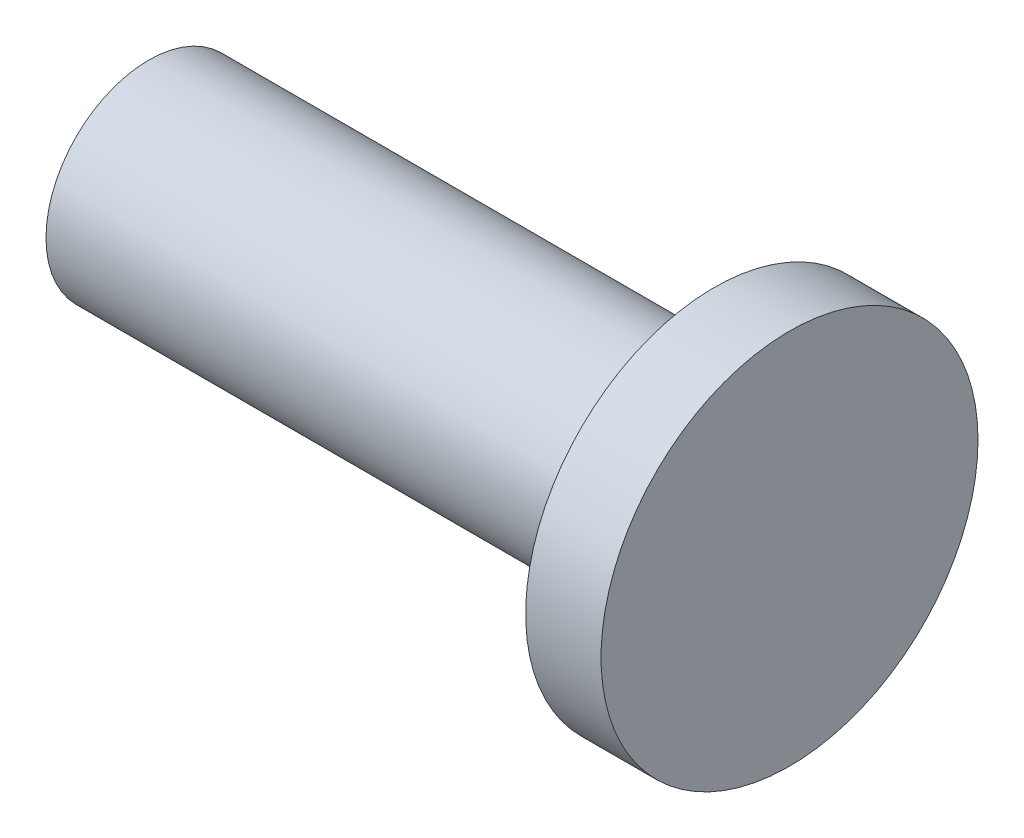
ISO-10303-21;
HEADER;
FILE_DESCRIPTION(('STEP AP214'),'2;1');
FILE_NAME('part.step','',(''),(''),'','','');
FILE_SCHEMA(('AUTOMOTIVE_DESIGN { 1 0 10303 214 1 1 1 1 }'));
ENDSEC;
DATA;
#1=APPLICATION_CONTEXT('core data for automotive mechanical design processes');
#2=APPLICATION_PROTOCOL_DEFINITION('international standard','automotive_design',2000,#1);
#3=PRODUCT_CONTEXT('',#1,'mechanical');
#4=PRODUCT('Part','Part','',(#3));
#5=PRODUCT_RELATED_PRODUCT_CATEGORY('part','',(#4));
#6=PRODUCT_DEFINITION_FORMATION('','',#4);
#7=PRODUCT_DEFINITION_CONTEXT('part definition',#1,'design');
#8=PRODUCT_DEFINITION('design','',#6,#7);
#9=PRODUCT_DEFINITION_SHAPE('','',#8);
#10=(LENGTH_UNIT() NAMED_UNIT(*) SI_UNIT(.MILLI.,.METRE.));
#11=(NAMED_UNIT(*) PLANE_ANGLE_UNIT() SI_UNIT($,.RADIAN.));
#12=(NAMED_UNIT(*) SI_UNIT($,.STERADIAN.) SOLID_ANGLE_UNIT());
#13=UNCERTAINTY_MEASURE_WITH_UNIT(LENGTH_MEASURE(1.E-05),#10,'distance_accuracy_value','');
#14=(GEOMETRIC_REPRESENTATION_CONTEXT(3) GLOBAL_UNCERTAINTY_ASSIGNED_CONTEXT((#13)) GLOBAL_UNIT_ASSIGNED_CONTEXT((#10,
#11,#12)) REPRESENTATION_CONTEXT('',''));
#15=CARTESIAN_POINT('',(0.,0.,0.));
#16=DIRECTION('',(0.,0.,1.));
#17=DIRECTION('',(1.,0.,0.));
#18=AXIS2_PLACEMENT_3D('',#15,#16,#17);
#19=CARTESIAN_POINT('',(15.,0.,0.));
#20=DIRECTION('',(-1.,0.,0.));
#21=DIRECTION('',(0.,0.,1.));
#22=AXIS2_PLACEMENT_3D('',#19,#20,#21);
#23=CYLINDRICAL_SURFACE('',#22,2.725);
#24=CARTESIAN_POINT('',(15.,0.,0.));
#25=DIRECTION('',(1.,0.,0.));
#26=DIRECTION('',(0.,0.,-1.));
#27=AXIS2_PLACEMENT_3D('',#24,#25,#26);
#28=CIRCLE('',#27,2.725);
#29=CARTESIAN_POINT('',(15.,0.,-2.725));
#30=VERTEX_POINT('',#29);
#31=EDGE_CURVE('E10',#30,#30,#28,.T.);
#32=ORIENTED_EDGE('',*,*,#31,.F.);
#33=EDGE_LOOP('',(#32));
#34=FACE_BOUND('',#33,.T.);
#35=CARTESIAN_POINT('',(0.,0.,0.));
#36=DIRECTION('',(1.,0.,0.));
#37=DIRECTION('',(0.,0.,-1.));
#38=AXIS2_PLACEMENT_3D('',#35,#36,#37);
#39=CIRCLE('',#38,2.725);
#40=CARTESIAN_POINT('',(0.,0.,-2.725));
#41=VERTEX_POINT('',#40);
#42=EDGE_CURVE('E40',#41,#41,#39,.T.);
#43=ORIENTED_EDGE('',*,*,#42,.T.);
#44=EDGE_LOOP('',(#43));
#45=FACE_BOUND('',#44,.T.);
#46=ADVANCED_FACE('F37',(#34,#45),#23,.T.);
#47=CARTESIAN_POINT('',(0.,0.,0.));
#48=DIRECTION('',(1.,0.,0.));
#49=DIRECTION('',(0.,0.,-1.));
#50=AXIS2_PLACEMENT_3D('',#47,#48,#49);
#51=PLANE('',#50);
#52=ORIENTED_EDGE('',*,*,#42,.F.);
#53=EDGE_LOOP('',(#52));
#54=FACE_BOUND('',#53,.T.);
#55=ADVANCED_FACE('F64',(#54),#51,.F.);
#56=CARTESIAN_POINT('',(17.,0.,0.));
#57=DIRECTION('',(-1.,0.,0.));
#58=DIRECTION('',(0.,0.,1.));
#59=AXIS2_PLACEMENT_3D('',#56,#57,#58);
#60=CYLINDRICAL_SURFACE('',#59,5.);
#61=CARTESIAN_POINT('',(17.,0.,0.));
#62=DIRECTION('',(1.,0.,0.));
#63=DIRECTION('',(0.,0.,-1.));
#64=AXIS2_PLACEMENT_3D('',#61,#62,#63);
#65=CIRCLE('',#64,5.);
#66=CARTESIAN_POINT('',(17.,0.,-5.));
#67=VERTEX_POINT('',#66);
#68=EDGE_CURVE('E49',#67,#67,#65,.T.);
#69=ORIENTED_EDGE('',*,*,#68,.F.);
#70=EDGE_LOOP('',(#69));
#71=FACE_BOUND('',#70,.T.);
#72=CARTESIAN_POINT('',(15.,0.,0.));
#73=DIRECTION('',(1.,0.,0.));
#74=DIRECTION('',(0.,0.,-1.));
#75=AXIS2_PLACEMENT_3D('',#72,#73,#74);
#76=CIRCLE('',#75,5.);
#77=CARTESIAN_POINT('',(15.,0.,-5.));
#78=VERTEX_POINT('',#77);
#79=EDGE_CURVE('E51',#78,#78,#76,.T.);
#80=ORIENTED_EDGE('',*,*,#79,.T.);
#81=EDGE_LOOP('',(#80));
#82=FACE_BOUND('',#81,.T.);
#83=ADVANCED_FACE('F61',(#71,#82),#60,.T.);
#84=CARTESIAN_POINT('',(17.,0.,0.));
#85=DIRECTION('',(1.,0.,0.));
#86=DIRECTION('',(0.,0.,-1.));
#87=AXIS2_PLACEMENT_3D('',#84,#85,#86);
#88=PLANE('',#87);
#89=ORIENTED_EDGE('',*,*,#68,.T.);
#90=EDGE_LOOP('',(#89));
#91=FACE_BOUND('',#90,.T.);
#92=ADVANCED_FACE('F59',(#91),#88,.T.);
#93=CARTESIAN_POINT('',(15.,0.,0.));
#94=DIRECTION('',(1.,0.,0.));
#95=DIRECTION('',(0.,0.,-1.));
#96=AXIS2_PLACEMENT_3D('',#93,#94,#95);
#97=PLANE('',#96);
#98=ORIENTED_EDGE('',*,*,#31,.T.);
#99=EDGE_LOOP('',(#98));
#100=FACE_BOUND('',#99,.T.);
#101=ORIENTED_EDGE('',*,*,#79,.F.);
#102=EDGE_LOOP('',(#101));
#103=FACE_BOUND('',#102,.T.);
#104=ADVANCED_FACE('F68',(#100,#103),#97,.F.);
#105=CLOSED_SHELL('',(#46,#55,#83,#92,#104));
#106=MANIFOLD_SOLID_BREP('B2',#105);
#107=ADVANCED_BREP_SHAPE_REPRESENTATION('',(#18,#106),#14);
#108=SHAPE_DEFINITION_REPRESENTATION(#9,#107);
ENDSEC;
END-ISO-10303-21;
